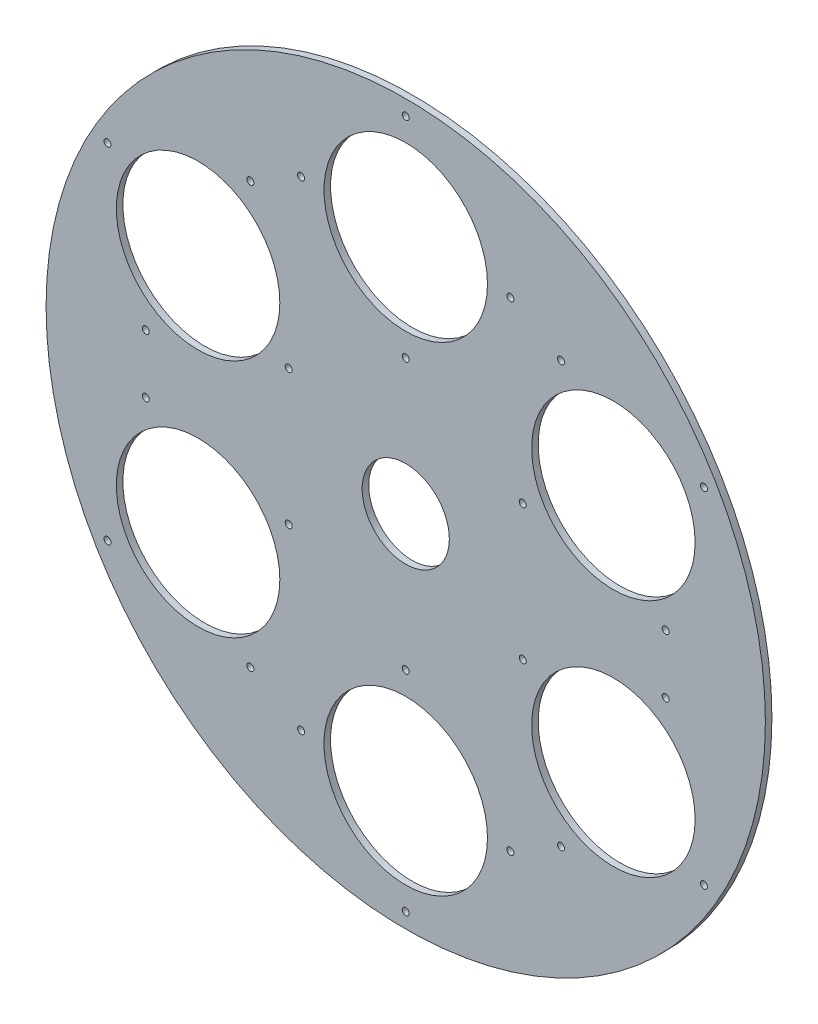
ISO-10303-21;
HEADER;
FILE_DESCRIPTION(('STEP AP214'),'2;1');
FILE_NAME('part.step','',(''),(''),'','','');
FILE_SCHEMA(('AUTOMOTIVE_DESIGN { 1 0 10303 214 1 1 1 1 }'));
ENDSEC;
DATA;
#1=APPLICATION_CONTEXT('core data for automotive mechanical design processes');
#2=APPLICATION_PROTOCOL_DEFINITION('international standard','automotive_design',2000,#1);
#3=PRODUCT_CONTEXT('',#1,'mechanical');
#4=PRODUCT('Part','Part','',(#3));
#5=PRODUCT_RELATED_PRODUCT_CATEGORY('part','',(#4));
#6=PRODUCT_DEFINITION_FORMATION('','',#4);
#7=PRODUCT_DEFINITION_CONTEXT('part definition',#1,'design');
#8=PRODUCT_DEFINITION('design','',#6,#7);
#9=PRODUCT_DEFINITION_SHAPE('','',#8);
#10=(LENGTH_UNIT() NAMED_UNIT(*) SI_UNIT(.MILLI.,.METRE.));
#11=(NAMED_UNIT(*) PLANE_ANGLE_UNIT() SI_UNIT($,.RADIAN.));
#12=(NAMED_UNIT(*) SI_UNIT($,.STERADIAN.) SOLID_ANGLE_UNIT());
#13=UNCERTAINTY_MEASURE_WITH_UNIT(LENGTH_MEASURE(1.E-05),#10,'distance_accuracy_value','');
#14=(GEOMETRIC_REPRESENTATION_CONTEXT(3) GLOBAL_UNCERTAINTY_ASSIGNED_CONTEXT((#13)) GLOBAL_UNIT_ASSIGNED_CONTEXT((#10,
#11,#12)) REPRESENTATION_CONTEXT('',''));
#15=CARTESIAN_POINT('',(0.,0.,0.));
#16=DIRECTION('',(0.,0.,1.));
#17=DIRECTION('',(1.,0.,0.));
#18=AXIS2_PLACEMENT_3D('',#15,#16,#17);
#19=CARTESIAN_POINT('',(0.,0.,3.));
#20=DIRECTION('',(0.,0.,1.));
#21=DIRECTION('',(1.,0.,0.));
#22=AXIS2_PLACEMENT_3D('',#19,#20,#21);
#23=PLANE('',#22);
#24=CARTESIAN_POINT('',(-95.2627944162812,-55.0000000000041,3.));
#25=DIRECTION('',(0.,0.,1.));
#26=DIRECTION('',(1.,0.,0.));
#27=AXIS2_PLACEMENT_3D('',#24,#25,#26);
#28=CIRCLE('',#27,37.5);
#29=CARTESIAN_POINT('',(-57.7627944162812,-55.0000000000041,3.));
#30=VERTEX_POINT('',#29);
#31=EDGE_CURVE('E284',#30,#30,#28,.T.);
#32=ORIENTED_EDGE('',*,*,#31,.F.);
#33=EDGE_LOOP('',(#32));
#34=FACE_BOUND('',#33,.T.);
#35=CARTESIAN_POINT('',(95.2627944162953,-54.9999999999959,3.));
#36=DIRECTION('',(0.,0.,1.));
#37=DIRECTION('',(1.,0.,0.));
#38=AXIS2_PLACEMENT_3D('',#35,#36,#37);
#39=CIRCLE('',#38,37.5);
#40=CARTESIAN_POINT('',(132.762794416295,-54.9999999999959,3.));
#41=VERTEX_POINT('',#40);
#42=EDGE_CURVE('E268',#41,#41,#39,.T.);
#43=ORIENTED_EDGE('',*,*,#42,.F.);
#44=EDGE_LOOP('',(#43));
#45=FACE_BOUND('',#44,.T.);
#46=CARTESIAN_POINT('',(0.,0.,3.));
#47=DIRECTION('',(0.,0.,1.));
#48=DIRECTION('',(1.,0.,0.));
#49=AXIS2_PLACEMENT_3D('',#46,#47,#48);
#50=CIRCLE('',#49,20.);
#51=CARTESIAN_POINT('',(20.,0.,3.));
#52=VERTEX_POINT('',#51);
#53=EDGE_CURVE('E252',#52,#52,#50,.T.);
#54=ORIENTED_EDGE('',*,*,#53,.F.);
#55=EDGE_LOOP('',(#54));
#56=FACE_BOUND('',#55,.T.);
#57=CARTESIAN_POINT('',(-71.2627944162868,96.5692193816537,3.));
#58=DIRECTION('',(0.,0.,1.));
#59=DIRECTION('',(1.,0.,0.));
#60=AXIS2_PLACEMENT_3D('',#57,#58,#59);
#61=CIRCLE('',#60,1.60000000000001);
#62=CARTESIAN_POINT('',(-69.6627944162868,96.5692193816537,3.));
#63=VERTEX_POINT('',#62);
#64=EDGE_CURVE('E236',#63,#63,#61,.T.);
#65=ORIENTED_EDGE('',*,*,#64,.F.);
#66=EDGE_LOOP('',(#65));
#67=FACE_BOUND('',#66,.T.);
#68=CARTESIAN_POINT('',(-119.262794416287,13.4307806183446,3.));
#69=DIRECTION('',(0.,0.,1.));
#70=DIRECTION('',(1.,0.,0.));
#71=AXIS2_PLACEMENT_3D('',#68,#69,#70);
#72=CIRCLE('',#71,1.6);
#73=CARTESIAN_POINT('',(-117.662794416287,13.4307806183446,3.));
#74=VERTEX_POINT('',#73);
#75=EDGE_CURVE('E220',#74,#74,#72,.T.);
#76=ORIENTED_EDGE('',*,*,#75,.F.);
#77=EDGE_LOOP('',(#76));
#78=FACE_BOUND('',#77,.T.);
#79=CARTESIAN_POINT('',(-119.262794416284,-13.4307806183493,3.));
#80=DIRECTION('',(0.,0.,1.));
#81=DIRECTION('',(1.,0.,0.));
#82=AXIS2_PLACEMENT_3D('',#79,#80,#81);
#83=CIRCLE('',#82,1.6);
#84=CARTESIAN_POINT('',(-117.662794416284,-13.4307806183493,3.));
#85=VERTEX_POINT('',#84);
#86=EDGE_CURVE('E204',#85,#85,#83,.T.);
#87=ORIENTED_EDGE('',*,*,#86,.F.);
#88=EDGE_LOOP('',(#87));
#89=FACE_BOUND('',#88,.T.);
#90=CARTESIAN_POINT('',(-71.2627944162843,-96.5692193816554,3.));
#91=DIRECTION('',(0.,0.,1.));
#92=DIRECTION('',(1.,0.,0.));
#93=AXIS2_PLACEMENT_3D('',#90,#91,#92);
#94=CIRCLE('',#93,1.60000000000001);
#95=CARTESIAN_POINT('',(-69.6627944162843,-96.5692193816554,3.));
#96=VERTEX_POINT('',#95);
#97=EDGE_CURVE('E188',#96,#96,#94,.T.);
#98=ORIENTED_EDGE('',*,*,#97,.F.);
#99=EDGE_LOOP('',(#98));
#100=FACE_BOUND('',#99,.T.);
#101=CARTESIAN_POINT('',(-47.9999999999947,-110.,3.));
#102=DIRECTION('',(0.,0.,1.));
#103=DIRECTION('',(1.,0.,0.));
#104=AXIS2_PLACEMENT_3D('',#101,#102,#103);
#105=CIRCLE('',#104,1.6);
#106=CARTESIAN_POINT('',(-46.3999999999947,-110.,3.));
#107=VERTEX_POINT('',#106);
#108=EDGE_CURVE('E172',#107,#107,#105,.T.);
#109=ORIENTED_EDGE('',*,*,#108,.F.);
#110=EDGE_LOOP('',(#109));
#111=FACE_BOUND('',#110,.T.);
#112=CARTESIAN_POINT('',(48.0000000000053,-110.,3.));
#113=DIRECTION('',(0.,0.,1.));
#114=DIRECTION('',(1.,0.,0.));
#115=AXIS2_PLACEMENT_3D('',#112,#113,#114);
#116=CIRCLE('',#115,1.6);
#117=CARTESIAN_POINT('',(49.6000000000053,-110.,3.));
#118=VERTEX_POINT('',#117);
#119=EDGE_CURVE('E156',#118,#118,#116,.T.);
#120=ORIENTED_EDGE('',*,*,#119,.F.);
#121=EDGE_LOOP('',(#120));
#122=FACE_BOUND('',#121,.T.);
#123=CARTESIAN_POINT('',(71.2627944162922,-96.5692193816508,3.));
#124=DIRECTION('',(0.,0.,1.));
#125=DIRECTION('',(1.,0.,0.));
#126=AXIS2_PLACEMENT_3D('',#123,#124,#125);
#127=CIRCLE('',#126,1.60000000000001);
#128=CARTESIAN_POINT('',(72.8627944162922,-96.5692193816508,3.));
#129=VERTEX_POINT('',#128);
#130=EDGE_CURVE('E140',#129,#129,#127,.T.);
#131=ORIENTED_EDGE('',*,*,#130,.F.);
#132=EDGE_LOOP('',(#131));
#133=FACE_BOUND('',#132,.T.);
#134=CARTESIAN_POINT('',(48.,110.,3.));
#135=DIRECTION('',(0.,0.,1.));
#136=DIRECTION('',(1.,0.,0.));
#137=AXIS2_PLACEMENT_3D('',#134,#135,#136);
#138=CIRCLE('',#137,1.6);
#139=CARTESIAN_POINT('',(49.6,110.,3.));
#140=VERTEX_POINT('',#139);
#141=EDGE_CURVE('E124',#140,#140,#138,.T.);
#142=ORIENTED_EDGE('',*,*,#141,.F.);
#143=EDGE_LOOP('',(#142));
#144=FACE_BOUND('',#143,.T.);
#145=CARTESIAN_POINT('',(136.832013797945,-78.9999999999977,3.));
#146=DIRECTION('',(0.,0.,1.));
#147=DIRECTION('',(1.,0.,0.));
#148=AXIS2_PLACEMENT_3D('',#145,#146,#147);
#149=CIRCLE('',#148,1.59999999999999);
#150=CARTESIAN_POINT('',(138.432013797945,-78.9999999999977,3.));
#151=VERTEX_POINT('',#150);
#152=EDGE_CURVE('E108',#151,#151,#149,.T.);
#153=ORIENTED_EDGE('',*,*,#152,.F.);
#154=EDGE_LOOP('',(#153));
#155=FACE_BOUND('',#154,.T.);
#156=CARTESIAN_POINT('',(53.693575034635,31.0000000000003,3.));
#157=DIRECTION('',(0.,0.,1.));
#158=DIRECTION('',(1.,0.,0.));
#159=AXIS2_PLACEMENT_3D('',#156,#157,#158);
#160=CIRCLE('',#159,1.6);
#161=CARTESIAN_POINT('',(55.293575034635,31.0000000000003,3.));
#162=VERTEX_POINT('',#161);
#163=EDGE_CURVE('E92',#162,#162,#160,.T.);
#164=ORIENTED_EDGE('',*,*,#163,.F.);
#165=EDGE_LOOP('',(#164));
#166=FACE_BOUND('',#165,.T.);
#167=CARTESIAN_POINT('',(136.832013797942,78.9999999999995,3.));
#168=DIRECTION('',(0.,0.,1.));
#169=DIRECTION('',(1.,0.,0.));
#170=AXIS2_PLACEMENT_3D('',#167,#168,#169);
#171=CIRCLE('',#170,1.59999999999999);
#172=CARTESIAN_POINT('',(138.432013797942,78.9999999999995,3.));
#173=VERTEX_POINT('',#172);
#174=EDGE_CURVE('E76',#173,#173,#171,.T.);
#175=ORIENTED_EDGE('',*,*,#174,.F.);
#176=EDGE_LOOP('',(#175));
#177=FACE_BOUND('',#176,.T.);
#178=CARTESIAN_POINT('',(71.2627944162885,96.5692193816529,3.));
#179=DIRECTION('',(0.,0.,1.));
#180=DIRECTION('',(1.,0.,0.));
#181=AXIS2_PLACEMENT_3D('',#178,#179,#180);
#182=CIRCLE('',#181,1.60000000000001);
#183=CARTESIAN_POINT('',(72.8627944162885,96.5692193816529,3.));
#184=VERTEX_POINT('',#183);
#185=EDGE_CURVE('E60',#184,#184,#182,.T.);
#186=ORIENTED_EDGE('',*,*,#185,.F.);
#187=EDGE_LOOP('',(#186));
#188=FACE_BOUND('',#187,.T.);
#189=CARTESIAN_POINT('',(0.,0.,3.));
#190=DIRECTION('',(0.,0.,1.));
#191=DIRECTION('',(1.,0.,0.));
#192=AXIS2_PLACEMENT_3D('',#189,#190,#191);
#193=CIRCLE('',#192,165.000000000005);
#194=CARTESIAN_POINT('',(165.000000000005,0.,3.));
#195=VERTEX_POINT('',#194);
#196=EDGE_CURVE('E10',#195,#195,#193,.T.);
#197=ORIENTED_EDGE('',*,*,#196,.T.);
#198=EDGE_LOOP('',(#197));
#199=FACE_BOUND('',#198,.T.);
#200=CARTESIAN_POINT('',(0.,110.,3.));
#201=DIRECTION('',(0.,0.,1.));
#202=DIRECTION('',(1.,0.,0.));
#203=AXIS2_PLACEMENT_3D('',#200,#201,#202);
#204=CIRCLE('',#203,37.5);
#205=CARTESIAN_POINT('',(37.5,110.,3.));
#206=VERTEX_POINT('',#205);
#207=EDGE_CURVE('E54',#206,#206,#204,.T.);
#208=ORIENTED_EDGE('',*,*,#207,.F.);
#209=EDGE_LOOP('',(#208));
#210=FACE_BOUND('',#209,.T.);
#211=CARTESIAN_POINT('',(-48.,110.,3.));
#212=DIRECTION('',(0.,0.,1.));
#213=DIRECTION('',(1.,0.,0.));
#214=AXIS2_PLACEMENT_3D('',#211,#212,#213);
#215=CIRCLE('',#214,1.6);
#216=CARTESIAN_POINT('',(-46.4,110.,3.));
#217=VERTEX_POINT('',#216);
#218=EDGE_CURVE('E68',#217,#217,#215,.T.);
#219=ORIENTED_EDGE('',*,*,#218,.F.);
#220=EDGE_LOOP('',(#219));
#221=FACE_BOUND('',#220,.T.);
#222=CARTESIAN_POINT('',(119.262794416288,13.4307806183465,3.));
#223=DIRECTION('',(0.,0.,1.));
#224=DIRECTION('',(1.,0.,0.));
#225=AXIS2_PLACEMENT_3D('',#222,#223,#224);
#226=CIRCLE('',#225,1.6);
#227=CARTESIAN_POINT('',(120.862794416288,13.4307806183465,3.));
#228=VERTEX_POINT('',#227);
#229=EDGE_CURVE('E84',#228,#228,#226,.T.);
#230=ORIENTED_EDGE('',*,*,#229,.F.);
#231=EDGE_LOOP('',(#230));
#232=FACE_BOUND('',#231,.T.);
#233=CARTESIAN_POINT('',(119.262794416292,-13.4307806183446,3.));
#234=DIRECTION('',(0.,0.,1.));
#235=DIRECTION('',(1.,0.,0.));
#236=AXIS2_PLACEMENT_3D('',#233,#234,#235);
#237=CIRCLE('',#236,1.6);
#238=CARTESIAN_POINT('',(120.862794416292,-13.4307806183446,3.));
#239=VERTEX_POINT('',#238);
#240=EDGE_CURVE('E100',#239,#239,#237,.T.);
#241=ORIENTED_EDGE('',*,*,#240,.F.);
#242=EDGE_LOOP('',(#241));
#243=FACE_BOUND('',#242,.T.);
#244=CARTESIAN_POINT('',(1.66533453693773E-13,158.,3.));
#245=DIRECTION('',(0.,0.,1.));
#246=DIRECTION('',(1.,0.,0.));
#247=AXIS2_PLACEMENT_3D('',#244,#245,#246);
#248=CIRCLE('',#247,1.6);
#249=CARTESIAN_POINT('',(1.60000000000016,158.,3.));
#250=VERTEX_POINT('',#249);
#251=EDGE_CURVE('E116',#250,#250,#248,.T.);
#252=ORIENTED_EDGE('',*,*,#251,.F.);
#253=EDGE_LOOP('',(#252));
#254=FACE_BOUND('',#253,.T.);
#255=CARTESIAN_POINT('',(-4.9960036108132E-13,62.,3.));
#256=DIRECTION('',(0.,0.,1.));
#257=DIRECTION('',(1.,0.,0.));
#258=AXIS2_PLACEMENT_3D('',#255,#256,#257);
#259=CIRCLE('',#258,1.6);
#260=CARTESIAN_POINT('',(1.5999999999995,62.,3.));
#261=VERTEX_POINT('',#260);
#262=EDGE_CURVE('E132',#261,#261,#259,.T.);
#263=ORIENTED_EDGE('',*,*,#262,.F.);
#264=EDGE_LOOP('',(#263));
#265=FACE_BOUND('',#264,.T.);
#266=CARTESIAN_POINT('',(53.6935750346391,-30.9999999999977,3.));
#267=DIRECTION('',(0.,0.,1.));
#268=DIRECTION('',(1.,0.,0.));
#269=AXIS2_PLACEMENT_3D('',#266,#267,#268);
#270=CIRCLE('',#269,1.6);
#271=CARTESIAN_POINT('',(55.2935750346391,-30.9999999999977,3.));
#272=VERTEX_POINT('',#271);
#273=EDGE_CURVE('E148',#272,#272,#270,.T.);
#274=ORIENTED_EDGE('',*,*,#273,.F.);
#275=EDGE_LOOP('',(#274));
#276=FACE_BOUND('',#275,.T.);
#277=CARTESIAN_POINT('',(5.27542201025743E-12,-158.,3.));
#278=DIRECTION('',(0.,0.,1.));
#279=DIRECTION('',(1.,0.,0.));
#280=AXIS2_PLACEMENT_3D('',#277,#278,#279);
#281=CIRCLE('',#280,1.6);
#282=CARTESIAN_POINT('',(1.60000000000527,-158.,3.));
#283=VERTEX_POINT('',#282);
#284=EDGE_CURVE('E164',#283,#283,#281,.T.);
#285=ORIENTED_EDGE('',*,*,#284,.F.);
#286=EDGE_LOOP('',(#285));
#287=FACE_BOUND('',#286,.T.);
#288=CARTESIAN_POINT('',(5.24178813000589E-12,-62.,3.));
#289=DIRECTION('',(0.,0.,1.));
#290=DIRECTION('',(1.,0.,0.));
#291=AXIS2_PLACEMENT_3D('',#288,#289,#290);
#292=CIRCLE('',#291,1.6);
#293=CARTESIAN_POINT('',(1.60000000000524,-62.,3.));
#294=VERTEX_POINT('',#293);
#295=EDGE_CURVE('E180',#294,#294,#292,.T.);
#296=ORIENTED_EDGE('',*,*,#295,.F.);
#297=EDGE_LOOP('',(#296));
#298=FACE_BOUND('',#297,.T.);
#299=CARTESIAN_POINT('',(-136.832013797937,-79.0000000000024,3.));
#300=DIRECTION('',(0.,0.,1.));
#301=DIRECTION('',(1.,0.,0.));
#302=AXIS2_PLACEMENT_3D('',#299,#300,#301);
#303=CIRCLE('',#302,1.59999999999999);
#304=CARTESIAN_POINT('',(-135.232013797937,-79.0000000000024,3.));
#305=VERTEX_POINT('',#304);
#306=EDGE_CURVE('E196',#305,#305,#303,.T.);
#307=ORIENTED_EDGE('',*,*,#306,.F.);
#308=EDGE_LOOP('',(#307));
#309=FACE_BOUND('',#308,.T.);
#310=CARTESIAN_POINT('',(-53.6935750346313,-31.0000000000023,3.));
#311=DIRECTION('',(0.,0.,1.));
#312=DIRECTION('',(1.,0.,0.));
#313=AXIS2_PLACEMENT_3D('',#310,#311,#312);
#314=CIRCLE('',#313,1.6);
#315=CARTESIAN_POINT('',(-52.0935750346313,-31.0000000000023,3.));
#316=VERTEX_POINT('',#315);
#317=EDGE_CURVE('E212',#316,#316,#314,.T.);
#318=ORIENTED_EDGE('',*,*,#317,.F.);
#319=EDGE_LOOP('',(#318));
#320=FACE_BOUND('',#319,.T.);
#321=CARTESIAN_POINT('',(-136.83201379794,78.9999999999976,3.));
#322=DIRECTION('',(0.,0.,1.));
#323=DIRECTION('',(1.,0.,0.));
#324=AXIS2_PLACEMENT_3D('',#321,#322,#323);
#325=CIRCLE('',#324,1.59999999999999);
#326=CARTESIAN_POINT('',(-135.23201379794,78.9999999999976,3.));
#327=VERTEX_POINT('',#326);
#328=EDGE_CURVE('E228',#327,#327,#325,.T.);
#329=ORIENTED_EDGE('',*,*,#328,.F.);
#330=EDGE_LOOP('',(#329));
#331=FACE_BOUND('',#330,.T.);
#332=CARTESIAN_POINT('',(-53.6935750346351,31.0000000000002,3.));
#333=DIRECTION('',(0.,0.,1.));
#334=DIRECTION('',(1.,0.,0.));
#335=AXIS2_PLACEMENT_3D('',#332,#333,#334);
#336=CIRCLE('',#335,1.6);
#337=CARTESIAN_POINT('',(-52.0935750346351,31.0000000000002,3.));
#338=VERTEX_POINT('',#337);
#339=EDGE_CURVE('E244',#338,#338,#336,.T.);
#340=ORIENTED_EDGE('',*,*,#339,.F.);
#341=EDGE_LOOP('',(#340));
#342=FACE_BOUND('',#341,.T.);
#343=CARTESIAN_POINT('',(95.2627944162906,55.0000000000041,3.));
#344=DIRECTION('',(0.,0.,1.));
#345=DIRECTION('',(1.,0.,0.));
#346=AXIS2_PLACEMENT_3D('',#343,#344,#345);
#347=CIRCLE('',#346,37.5);
#348=CARTESIAN_POINT('',(132.762794416291,55.0000000000041,3.));
#349=VERTEX_POINT('',#348);
#350=EDGE_CURVE('E260',#349,#349,#347,.T.);
#351=ORIENTED_EDGE('',*,*,#350,.F.);
#352=EDGE_LOOP('',(#351));
#353=FACE_BOUND('',#352,.T.);
#354=CARTESIAN_POINT('',(9.33875076766146E-12,-110.,3.));
#355=DIRECTION('',(0.,0.,1.));
#356=DIRECTION('',(1.,0.,0.));
#357=AXIS2_PLACEMENT_3D('',#354,#355,#356);
#358=CIRCLE('',#357,37.5);
#359=CARTESIAN_POINT('',(37.5000000000093,-110.,3.));
#360=VERTEX_POINT('',#359);
#361=EDGE_CURVE('E276',#360,#360,#358,.T.);
#362=ORIENTED_EDGE('',*,*,#361,.F.);
#363=EDGE_LOOP('',(#362));
#364=FACE_BOUND('',#363,.T.);
#365=CARTESIAN_POINT('',(-95.262794416286,54.9999999999959,3.));
#366=DIRECTION('',(0.,0.,1.));
#367=DIRECTION('',(1.,0.,0.));
#368=AXIS2_PLACEMENT_3D('',#365,#366,#367);
#369=CIRCLE('',#368,37.5);
#370=CARTESIAN_POINT('',(-57.762794416286,54.9999999999959,3.));
#371=VERTEX_POINT('',#370);
#372=EDGE_CURVE('E292',#371,#371,#369,.T.);
#373=ORIENTED_EDGE('',*,*,#372,.F.);
#374=EDGE_LOOP('',(#373));
#375=FACE_BOUND('',#374,.T.);
#376=ADVANCED_FACE('F41',(#34,#45,#56,#67,#78,#89,#100,#111,#122,#133,#144,#155,#166,#177,#188,
#199,#210,#221,#232,#243,#254,#265,#276,#287,#298,#309,#320,#331,#342,#353,#364,#375),#23,.T.);
#377=CARTESIAN_POINT('',(0.,0.,0.));
#378=DIRECTION('',(0.,0.,1.));
#379=DIRECTION('',(1.,0.,0.));
#380=AXIS2_PLACEMENT_3D('',#377,#378,#379);
#381=PLANE('',#380);
#382=CARTESIAN_POINT('',(0.,0.,0.));
#383=DIRECTION('',(0.,0.,1.));
#384=DIRECTION('',(1.,0.,0.));
#385=AXIS2_PLACEMENT_3D('',#382,#383,#384);
#386=CIRCLE('',#385,165.000000000005);
#387=CARTESIAN_POINT('',(165.000000000005,0.,0.));
#388=VERTEX_POINT('',#387);
#389=EDGE_CURVE('E45',#388,#388,#386,.T.);
#390=ORIENTED_EDGE('',*,*,#389,.F.);
#391=EDGE_LOOP('',(#390));
#392=FACE_BOUND('',#391,.T.);
#393=CARTESIAN_POINT('',(0.,110.,0.));
#394=DIRECTION('',(0.,0.,1.));
#395=DIRECTION('',(1.,0.,0.));
#396=AXIS2_PLACEMENT_3D('',#393,#394,#395);
#397=CIRCLE('',#396,37.5);
#398=CARTESIAN_POINT('',(37.5,110.,0.));
#399=VERTEX_POINT('',#398);
#400=EDGE_CURVE('E56',#399,#399,#397,.T.);
#401=ORIENTED_EDGE('',*,*,#400,.T.);
#402=EDGE_LOOP('',(#401));
#403=FACE_BOUND('',#402,.T.);
#404=CARTESIAN_POINT('',(71.2627944162885,96.5692193816529,0.));
#405=DIRECTION('',(0.,0.,1.));
#406=DIRECTION('',(1.,0.,0.));
#407=AXIS2_PLACEMENT_3D('',#404,#405,#406);
#408=CIRCLE('',#407,1.60000000000001);
#409=CARTESIAN_POINT('',(72.8627944162885,96.5692193816529,0.));
#410=VERTEX_POINT('',#409);
#411=EDGE_CURVE('E64',#410,#410,#408,.T.);
#412=ORIENTED_EDGE('',*,*,#411,.T.);
#413=EDGE_LOOP('',(#412));
#414=FACE_BOUND('',#413,.T.);
#415=CARTESIAN_POINT('',(-48.,110.,0.));
#416=DIRECTION('',(0.,0.,1.));
#417=DIRECTION('',(1.,0.,0.));
#418=AXIS2_PLACEMENT_3D('',#415,#416,#417);
#419=CIRCLE('',#418,1.6);
#420=CARTESIAN_POINT('',(-46.4,110.,0.));
#421=VERTEX_POINT('',#420);
#422=EDGE_CURVE('E72',#421,#421,#419,.T.);
#423=ORIENTED_EDGE('',*,*,#422,.T.);
#424=EDGE_LOOP('',(#423));
#425=FACE_BOUND('',#424,.T.);
#426=CARTESIAN_POINT('',(136.832013797942,78.9999999999995,0.));
#427=DIRECTION('',(0.,0.,1.));
#428=DIRECTION('',(1.,0.,0.));
#429=AXIS2_PLACEMENT_3D('',#426,#427,#428);
#430=CIRCLE('',#429,1.59999999999999);
#431=CARTESIAN_POINT('',(138.432013797942,78.9999999999995,0.));
#432=VERTEX_POINT('',#431);
#433=EDGE_CURVE('E80',#432,#432,#430,.T.);
#434=ORIENTED_EDGE('',*,*,#433,.T.);
#435=EDGE_LOOP('',(#434));
#436=FACE_BOUND('',#435,.T.);
#437=CARTESIAN_POINT('',(119.262794416288,13.4307806183465,0.));
#438=DIRECTION('',(0.,0.,1.));
#439=DIRECTION('',(1.,0.,0.));
#440=AXIS2_PLACEMENT_3D('',#437,#438,#439);
#441=CIRCLE('',#440,1.6);
#442=CARTESIAN_POINT('',(120.862794416288,13.4307806183465,0.));
#443=VERTEX_POINT('',#442);
#444=EDGE_CURVE('E88',#443,#443,#441,.T.);
#445=ORIENTED_EDGE('',*,*,#444,.T.);
#446=EDGE_LOOP('',(#445));
#447=FACE_BOUND('',#446,.T.);
#448=CARTESIAN_POINT('',(53.693575034635,31.0000000000003,0.));
#449=DIRECTION('',(0.,0.,1.));
#450=DIRECTION('',(1.,0.,0.));
#451=AXIS2_PLACEMENT_3D('',#448,#449,#450);
#452=CIRCLE('',#451,1.6);
#453=CARTESIAN_POINT('',(55.293575034635,31.0000000000003,0.));
#454=VERTEX_POINT('',#453);
#455=EDGE_CURVE('E96',#454,#454,#452,.T.);
#456=ORIENTED_EDGE('',*,*,#455,.T.);
#457=EDGE_LOOP('',(#456));
#458=FACE_BOUND('',#457,.T.);
#459=CARTESIAN_POINT('',(119.262794416292,-13.4307806183446,0.));
#460=DIRECTION('',(0.,0.,1.));
#461=DIRECTION('',(1.,0.,0.));
#462=AXIS2_PLACEMENT_3D('',#459,#460,#461);
#463=CIRCLE('',#462,1.6);
#464=CARTESIAN_POINT('',(120.862794416292,-13.4307806183446,0.));
#465=VERTEX_POINT('',#464);
#466=EDGE_CURVE('E104',#465,#465,#463,.T.);
#467=ORIENTED_EDGE('',*,*,#466,.T.);
#468=EDGE_LOOP('',(#467));
#469=FACE_BOUND('',#468,.T.);
#470=CARTESIAN_POINT('',(136.832013797945,-78.9999999999977,0.));
#471=DIRECTION('',(0.,0.,1.));
#472=DIRECTION('',(1.,0.,0.));
#473=AXIS2_PLACEMENT_3D('',#470,#471,#472);
#474=CIRCLE('',#473,1.59999999999999);
#475=CARTESIAN_POINT('',(138.432013797945,-78.9999999999977,0.));
#476=VERTEX_POINT('',#475);
#477=EDGE_CURVE('E112',#476,#476,#474,.T.);
#478=ORIENTED_EDGE('',*,*,#477,.T.);
#479=EDGE_LOOP('',(#478));
#480=FACE_BOUND('',#479,.T.);
#481=CARTESIAN_POINT('',(1.66533453693773E-13,158.,0.));
#482=DIRECTION('',(0.,0.,1.));
#483=DIRECTION('',(1.,0.,0.));
#484=AXIS2_PLACEMENT_3D('',#481,#482,#483);
#485=CIRCLE('',#484,1.6);
#486=CARTESIAN_POINT('',(1.60000000000016,158.,0.));
#487=VERTEX_POINT('',#486);
#488=EDGE_CURVE('E120',#487,#487,#485,.T.);
#489=ORIENTED_EDGE('',*,*,#488,.T.);
#490=EDGE_LOOP('',(#489));
#491=FACE_BOUND('',#490,.T.);
#492=CARTESIAN_POINT('',(48.,110.,0.));
#493=DIRECTION('',(0.,0.,1.));
#494=DIRECTION('',(1.,0.,0.));
#495=AXIS2_PLACEMENT_3D('',#492,#493,#494);
#496=CIRCLE('',#495,1.6);
#497=CARTESIAN_POINT('',(49.6,110.,0.));
#498=VERTEX_POINT('',#497);
#499=EDGE_CURVE('E128',#498,#498,#496,.T.);
#500=ORIENTED_EDGE('',*,*,#499,.T.);
#501=EDGE_LOOP('',(#500));
#502=FACE_BOUND('',#501,.T.);
#503=CARTESIAN_POINT('',(-4.9960036108132E-13,62.,0.));
#504=DIRECTION('',(0.,0.,1.));
#505=DIRECTION('',(1.,0.,0.));
#506=AXIS2_PLACEMENT_3D('',#503,#504,#505);
#507=CIRCLE('',#506,1.6);
#508=CARTESIAN_POINT('',(1.5999999999995,62.,0.));
#509=VERTEX_POINT('',#508);
#510=EDGE_CURVE('E136',#509,#509,#507,.T.);
#511=ORIENTED_EDGE('',*,*,#510,.T.);
#512=EDGE_LOOP('',(#511));
#513=FACE_BOUND('',#512,.T.);
#514=CARTESIAN_POINT('',(71.2627944162922,-96.5692193816508,0.));
#515=DIRECTION('',(0.,0.,1.));
#516=DIRECTION('',(1.,0.,0.));
#517=AXIS2_PLACEMENT_3D('',#514,#515,#516);
#518=CIRCLE('',#517,1.60000000000001);
#519=CARTESIAN_POINT('',(72.8627944162922,-96.5692193816508,0.));
#520=VERTEX_POINT('',#519);
#521=EDGE_CURVE('E144',#520,#520,#518,.T.);
#522=ORIENTED_EDGE('',*,*,#521,.T.);
#523=EDGE_LOOP('',(#522));
#524=FACE_BOUND('',#523,.T.);
#525=CARTESIAN_POINT('',(53.6935750346391,-30.9999999999977,0.));
#526=DIRECTION('',(0.,0.,1.));
#527=DIRECTION('',(1.,0.,0.));
#528=AXIS2_PLACEMENT_3D('',#525,#526,#527);
#529=CIRCLE('',#528,1.6);
#530=CARTESIAN_POINT('',(55.2935750346391,-30.9999999999977,0.));
#531=VERTEX_POINT('',#530);
#532=EDGE_CURVE('E152',#531,#531,#529,.T.);
#533=ORIENTED_EDGE('',*,*,#532,.T.);
#534=EDGE_LOOP('',(#533));
#535=FACE_BOUND('',#534,.T.);
#536=CARTESIAN_POINT('',(48.0000000000053,-110.,0.));
#537=DIRECTION('',(0.,0.,1.));
#538=DIRECTION('',(1.,0.,0.));
#539=AXIS2_PLACEMENT_3D('',#536,#537,#538);
#540=CIRCLE('',#539,1.6);
#541=CARTESIAN_POINT('',(49.6000000000053,-110.,0.));
#542=VERTEX_POINT('',#541);
#543=EDGE_CURVE('E160',#542,#542,#540,.T.);
#544=ORIENTED_EDGE('',*,*,#543,.T.);
#545=EDGE_LOOP('',(#544));
#546=FACE_BOUND('',#545,.T.);
#547=CARTESIAN_POINT('',(5.27542201025743E-12,-158.,0.));
#548=DIRECTION('',(0.,0.,1.));
#549=DIRECTION('',(1.,0.,0.));
#550=AXIS2_PLACEMENT_3D('',#547,#548,#549);
#551=CIRCLE('',#550,1.6);
#552=CARTESIAN_POINT('',(1.60000000000527,-158.,0.));
#553=VERTEX_POINT('',#552);
#554=EDGE_CURVE('E168',#553,#553,#551,.T.);
#555=ORIENTED_EDGE('',*,*,#554,.T.);
#556=EDGE_LOOP('',(#555));
#557=FACE_BOUND('',#556,.T.);
#558=CARTESIAN_POINT('',(-47.9999999999947,-110.,0.));
#559=DIRECTION('',(0.,0.,1.));
#560=DIRECTION('',(1.,0.,0.));
#561=AXIS2_PLACEMENT_3D('',#558,#559,#560);
#562=CIRCLE('',#561,1.6);
#563=CARTESIAN_POINT('',(-46.3999999999947,-110.,0.));
#564=VERTEX_POINT('',#563);
#565=EDGE_CURVE('E176',#564,#564,#562,.T.);
#566=ORIENTED_EDGE('',*,*,#565,.T.);
#567=EDGE_LOOP('',(#566));
#568=FACE_BOUND('',#567,.T.);
#569=CARTESIAN_POINT('',(5.24178813000589E-12,-62.,0.));
#570=DIRECTION('',(0.,0.,1.));
#571=DIRECTION('',(1.,0.,0.));
#572=AXIS2_PLACEMENT_3D('',#569,#570,#571);
#573=CIRCLE('',#572,1.6);
#574=CARTESIAN_POINT('',(1.60000000000524,-62.,0.));
#575=VERTEX_POINT('',#574);
#576=EDGE_CURVE('E184',#575,#575,#573,.T.);
#577=ORIENTED_EDGE('',*,*,#576,.T.);
#578=EDGE_LOOP('',(#577));
#579=FACE_BOUND('',#578,.T.);
#580=CARTESIAN_POINT('',(-71.2627944162843,-96.5692193816554,0.));
#581=DIRECTION('',(0.,0.,1.));
#582=DIRECTION('',(1.,0.,0.));
#583=AXIS2_PLACEMENT_3D('',#580,#581,#582);
#584=CIRCLE('',#583,1.60000000000001);
#585=CARTESIAN_POINT('',(-69.6627944162843,-96.5692193816554,0.));
#586=VERTEX_POINT('',#585);
#587=EDGE_CURVE('E192',#586,#586,#584,.T.);
#588=ORIENTED_EDGE('',*,*,#587,.T.);
#589=EDGE_LOOP('',(#588));
#590=FACE_BOUND('',#589,.T.);
#591=CARTESIAN_POINT('',(-136.832013797937,-79.0000000000024,0.));
#592=DIRECTION('',(0.,0.,1.));
#593=DIRECTION('',(1.,0.,0.));
#594=AXIS2_PLACEMENT_3D('',#591,#592,#593);
#595=CIRCLE('',#594,1.59999999999999);
#596=CARTESIAN_POINT('',(-135.232013797937,-79.0000000000024,0.));
#597=VERTEX_POINT('',#596);
#598=EDGE_CURVE('E200',#597,#597,#595,.T.);
#599=ORIENTED_EDGE('',*,*,#598,.T.);
#600=EDGE_LOOP('',(#599));
#601=FACE_BOUND('',#600,.T.);
#602=CARTESIAN_POINT('',(-119.262794416284,-13.4307806183493,0.));
#603=DIRECTION('',(0.,0.,1.));
#604=DIRECTION('',(1.,0.,0.));
#605=AXIS2_PLACEMENT_3D('',#602,#603,#604);
#606=CIRCLE('',#605,1.6);
#607=CARTESIAN_POINT('',(-117.662794416284,-13.4307806183493,0.));
#608=VERTEX_POINT('',#607);
#609=EDGE_CURVE('E208',#608,#608,#606,.T.);
#610=ORIENTED_EDGE('',*,*,#609,.T.);
#611=EDGE_LOOP('',(#610));
#612=FACE_BOUND('',#611,.T.);
#613=CARTESIAN_POINT('',(-53.6935750346313,-31.0000000000023,0.));
#614=DIRECTION('',(0.,0.,1.));
#615=DIRECTION('',(1.,0.,0.));
#616=AXIS2_PLACEMENT_3D('',#613,#614,#615);
#617=CIRCLE('',#616,1.6);
#618=CARTESIAN_POINT('',(-52.0935750346313,-31.0000000000023,0.));
#619=VERTEX_POINT('',#618);
#620=EDGE_CURVE('E216',#619,#619,#617,.T.);
#621=ORIENTED_EDGE('',*,*,#620,.T.);
#622=EDGE_LOOP('',(#621));
#623=FACE_BOUND('',#622,.T.);
#624=CARTESIAN_POINT('',(-119.262794416287,13.4307806183446,0.));
#625=DIRECTION('',(0.,0.,1.));
#626=DIRECTION('',(1.,0.,0.));
#627=AXIS2_PLACEMENT_3D('',#624,#625,#626);
#628=CIRCLE('',#627,1.6);
#629=CARTESIAN_POINT('',(-117.662794416287,13.4307806183446,0.));
#630=VERTEX_POINT('',#629);
#631=EDGE_CURVE('E224',#630,#630,#628,.T.);
#632=ORIENTED_EDGE('',*,*,#631,.T.);
#633=EDGE_LOOP('',(#632));
#634=FACE_BOUND('',#633,.T.);
#635=CARTESIAN_POINT('',(-136.83201379794,78.9999999999976,0.));
#636=DIRECTION('',(0.,0.,1.));
#637=DIRECTION('',(1.,0.,0.));
#638=AXIS2_PLACEMENT_3D('',#635,#636,#637);
#639=CIRCLE('',#638,1.59999999999999);
#640=CARTESIAN_POINT('',(-135.23201379794,78.9999999999976,0.));
#641=VERTEX_POINT('',#640);
#642=EDGE_CURVE('E232',#641,#641,#639,.T.);
#643=ORIENTED_EDGE('',*,*,#642,.T.);
#644=EDGE_LOOP('',(#643));
#645=FACE_BOUND('',#644,.T.);
#646=CARTESIAN_POINT('',(-71.2627944162868,96.5692193816537,0.));
#647=DIRECTION('',(0.,0.,1.));
#648=DIRECTION('',(1.,0.,0.));
#649=AXIS2_PLACEMENT_3D('',#646,#647,#648);
#650=CIRCLE('',#649,1.60000000000001);
#651=CARTESIAN_POINT('',(-69.6627944162868,96.5692193816537,0.));
#652=VERTEX_POINT('',#651);
#653=EDGE_CURVE('E240',#652,#652,#650,.T.);
#654=ORIENTED_EDGE('',*,*,#653,.T.);
#655=EDGE_LOOP('',(#654));
#656=FACE_BOUND('',#655,.T.);
#657=CARTESIAN_POINT('',(-53.6935750346351,31.0000000000002,0.));
#658=DIRECTION('',(0.,0.,1.));
#659=DIRECTION('',(1.,0.,0.));
#660=AXIS2_PLACEMENT_3D('',#657,#658,#659);
#661=CIRCLE('',#660,1.6);
#662=CARTESIAN_POINT('',(-52.0935750346351,31.0000000000002,0.));
#663=VERTEX_POINT('',#662);
#664=EDGE_CURVE('E248',#663,#663,#661,.T.);
#665=ORIENTED_EDGE('',*,*,#664,.T.);
#666=EDGE_LOOP('',(#665));
#667=FACE_BOUND('',#666,.T.);
#668=CARTESIAN_POINT('',(0.,0.,0.));
#669=DIRECTION('',(0.,0.,1.));
#670=DIRECTION('',(1.,0.,0.));
#671=AXIS2_PLACEMENT_3D('',#668,#669,#670);
#672=CIRCLE('',#671,20.);
#673=CARTESIAN_POINT('',(20.,0.,0.));
#674=VERTEX_POINT('',#673);
#675=EDGE_CURVE('E256',#674,#674,#672,.T.);
#676=ORIENTED_EDGE('',*,*,#675,.T.);
#677=EDGE_LOOP('',(#676));
#678=FACE_BOUND('',#677,.T.);
#679=CARTESIAN_POINT('',(95.2627944162906,55.0000000000041,0.));
#680=DIRECTION('',(0.,0.,1.));
#681=DIRECTION('',(1.,0.,0.));
#682=AXIS2_PLACEMENT_3D('',#679,#680,#681);
#683=CIRCLE('',#682,37.5);
#684=CARTESIAN_POINT('',(132.762794416291,55.0000000000041,0.));
#685=VERTEX_POINT('',#684);
#686=EDGE_CURVE('E264',#685,#685,#683,.T.);
#687=ORIENTED_EDGE('',*,*,#686,.T.);
#688=EDGE_LOOP('',(#687));
#689=FACE_BOUND('',#688,.T.);
#690=CARTESIAN_POINT('',(95.2627944162953,-54.9999999999959,0.));
#691=DIRECTION('',(0.,0.,1.));
#692=DIRECTION('',(1.,0.,0.));
#693=AXIS2_PLACEMENT_3D('',#690,#691,#692);
#694=CIRCLE('',#693,37.5);
#695=CARTESIAN_POINT('',(132.762794416295,-54.9999999999959,0.));
#696=VERTEX_POINT('',#695);
#697=EDGE_CURVE('E272',#696,#696,#694,.T.);
#698=ORIENTED_EDGE('',*,*,#697,.T.);
#699=EDGE_LOOP('',(#698));
#700=FACE_BOUND('',#699,.T.);
#701=CARTESIAN_POINT('',(9.33875076766146E-12,-110.,0.));
#702=DIRECTION('',(0.,0.,1.));
#703=DIRECTION('',(1.,0.,0.));
#704=AXIS2_PLACEMENT_3D('',#701,#702,#703);
#705=CIRCLE('',#704,37.5);
#706=CARTESIAN_POINT('',(37.5000000000093,-110.,0.));
#707=VERTEX_POINT('',#706);
#708=EDGE_CURVE('E280',#707,#707,#705,.T.);
#709=ORIENTED_EDGE('',*,*,#708,.T.);
#710=EDGE_LOOP('',(#709));
#711=FACE_BOUND('',#710,.T.);
#712=CARTESIAN_POINT('',(-95.2627944162812,-55.0000000000041,0.));
#713=DIRECTION('',(0.,0.,1.));
#714=DIRECTION('',(1.,0.,0.));
#715=AXIS2_PLACEMENT_3D('',#712,#713,#714);
#716=CIRCLE('',#715,37.5);
#717=CARTESIAN_POINT('',(-57.7627944162812,-55.0000000000041,0.));
#718=VERTEX_POINT('',#717);
#719=EDGE_CURVE('E288',#718,#718,#716,.T.);
#720=ORIENTED_EDGE('',*,*,#719,.T.);
#721=EDGE_LOOP('',(#720));
#722=FACE_BOUND('',#721,.T.);
#723=CARTESIAN_POINT('',(-95.262794416286,54.9999999999959,0.));
#724=DIRECTION('',(0.,0.,1.));
#725=DIRECTION('',(1.,0.,0.));
#726=AXIS2_PLACEMENT_3D('',#723,#724,#725);
#727=CIRCLE('',#726,37.5);
#728=CARTESIAN_POINT('',(-57.762794416286,54.9999999999959,0.));
#729=VERTEX_POINT('',#728);
#730=EDGE_CURVE('E296',#729,#729,#727,.T.);
#731=ORIENTED_EDGE('',*,*,#730,.T.);
#732=EDGE_LOOP('',(#731));
#733=FACE_BOUND('',#732,.T.);
#734=ADVANCED_FACE('F308',(#392,#403,#414,#425,#436,#447,#458,#469,#480,#491,#502,#513,#524,
#535,#546,#557,#568,#579,#590,#601,#612,#623,#634,#645,#656,#667,#678,#689,#700,#711,#722,#733),
#381,.F.);
#735=CARTESIAN_POINT('',(0.,0.,3.));
#736=DIRECTION('',(0.,0.,-1.));
#737=DIRECTION('',(-1.,0.,0.));
#738=AXIS2_PLACEMENT_3D('',#735,#736,#737);
#739=CYLINDRICAL_SURFACE('',#738,165.000000000005);
#740=ORIENTED_EDGE('',*,*,#196,.F.);
#741=EDGE_LOOP('',(#740));
#742=FACE_BOUND('',#741,.T.);
#743=ORIENTED_EDGE('',*,*,#389,.T.);
#744=EDGE_LOOP('',(#743));
#745=FACE_BOUND('',#744,.T.);
#746=ADVANCED_FACE('F43',(#742,#745),#739,.T.);
#747=CARTESIAN_POINT('',(0.,110.,3.));
#748=DIRECTION('',(0.,0.,-1.));
#749=DIRECTION('',(-1.,0.,0.));
#750=AXIS2_PLACEMENT_3D('',#747,#748,#749);
#751=CYLINDRICAL_SURFACE('',#750,37.5);
#752=ORIENTED_EDGE('',*,*,#207,.T.);
#753=EDGE_LOOP('',(#752));
#754=FACE_BOUND('',#753,.T.);
#755=ORIENTED_EDGE('',*,*,#400,.F.);
#756=EDGE_LOOP('',(#755));
#757=FACE_BOUND('',#756,.T.);
#758=ADVANCED_FACE('F318',(#754,#757),#751,.F.);
#759=CARTESIAN_POINT('',(71.2627944162885,96.5692193816529,3.));
#760=DIRECTION('',(0.,0.,-1.));
#761=DIRECTION('',(-1.,0.,0.));
#762=AXIS2_PLACEMENT_3D('',#759,#760,#761);
#763=CYLINDRICAL_SURFACE('',#762,1.60000000000001);
#764=ORIENTED_EDGE('',*,*,#185,.T.);
#765=EDGE_LOOP('',(#764));
#766=FACE_BOUND('',#765,.T.);
#767=ORIENTED_EDGE('',*,*,#411,.F.);
#768=EDGE_LOOP('',(#767));
#769=FACE_BOUND('',#768,.T.);
#770=ADVANCED_FACE('F321',(#766,#769),#763,.F.);
#771=CARTESIAN_POINT('',(-48.,110.,3.));
#772=DIRECTION('',(0.,0.,-1.));
#773=DIRECTION('',(-1.,0.,0.));
#774=AXIS2_PLACEMENT_3D('',#771,#772,#773);
#775=CYLINDRICAL_SURFACE('',#774,1.6);
#776=ORIENTED_EDGE('',*,*,#218,.T.);
#777=EDGE_LOOP('',(#776));
#778=FACE_BOUND('',#777,.T.);
#779=ORIENTED_EDGE('',*,*,#422,.F.);
#780=EDGE_LOOP('',(#779));
#781=FACE_BOUND('',#780,.T.);
#782=ADVANCED_FACE('F325',(#778,#781),#775,.F.);
#783=CARTESIAN_POINT('',(136.832013797942,78.9999999999995,3.));
#784=DIRECTION('',(0.,0.,-1.));
#785=DIRECTION('',(-1.,0.,0.));
#786=AXIS2_PLACEMENT_3D('',#783,#784,#785);
#787=CYLINDRICAL_SURFACE('',#786,1.59999999999999);
#788=ORIENTED_EDGE('',*,*,#174,.T.);
#789=EDGE_LOOP('',(#788));
#790=FACE_BOUND('',#789,.T.);
#791=ORIENTED_EDGE('',*,*,#433,.F.);
#792=EDGE_LOOP('',(#791));
#793=FACE_BOUND('',#792,.T.);
#794=ADVANCED_FACE('F329',(#790,#793),#787,.F.);
#795=CARTESIAN_POINT('',(119.262794416288,13.4307806183465,3.));
#796=DIRECTION('',(0.,0.,-1.));
#797=DIRECTION('',(-1.,0.,0.));
#798=AXIS2_PLACEMENT_3D('',#795,#796,#797);
#799=CYLINDRICAL_SURFACE('',#798,1.6);
#800=ORIENTED_EDGE('',*,*,#229,.T.);
#801=EDGE_LOOP('',(#800));
#802=FACE_BOUND('',#801,.T.);
#803=ORIENTED_EDGE('',*,*,#444,.F.);
#804=EDGE_LOOP('',(#803));
#805=FACE_BOUND('',#804,.T.);
#806=ADVANCED_FACE('F333',(#802,#805),#799,.F.);
#807=CARTESIAN_POINT('',(53.693575034635,31.0000000000003,3.));
#808=DIRECTION('',(0.,0.,-1.));
#809=DIRECTION('',(-1.,0.,0.));
#810=AXIS2_PLACEMENT_3D('',#807,#808,#809);
#811=CYLINDRICAL_SURFACE('',#810,1.6);
#812=ORIENTED_EDGE('',*,*,#163,.T.);
#813=EDGE_LOOP('',(#812));
#814=FACE_BOUND('',#813,.T.);
#815=ORIENTED_EDGE('',*,*,#455,.F.);
#816=EDGE_LOOP('',(#815));
#817=FACE_BOUND('',#816,.T.);
#818=ADVANCED_FACE('F337',(#814,#817),#811,.F.);
#819=CARTESIAN_POINT('',(119.262794416292,-13.4307806183446,3.));
#820=DIRECTION('',(0.,0.,-1.));
#821=DIRECTION('',(-1.,0.,0.));
#822=AXIS2_PLACEMENT_3D('',#819,#820,#821);
#823=CYLINDRICAL_SURFACE('',#822,1.6);
#824=ORIENTED_EDGE('',*,*,#240,.T.);
#825=EDGE_LOOP('',(#824));
#826=FACE_BOUND('',#825,.T.);
#827=ORIENTED_EDGE('',*,*,#466,.F.);
#828=EDGE_LOOP('',(#827));
#829=FACE_BOUND('',#828,.T.);
#830=ADVANCED_FACE('F341',(#826,#829),#823,.F.);
#831=CARTESIAN_POINT('',(136.832013797945,-78.9999999999977,3.));
#832=DIRECTION('',(0.,0.,-1.));
#833=DIRECTION('',(-1.,0.,0.));
#834=AXIS2_PLACEMENT_3D('',#831,#832,#833);
#835=CYLINDRICAL_SURFACE('',#834,1.59999999999999);
#836=ORIENTED_EDGE('',*,*,#152,.T.);
#837=EDGE_LOOP('',(#836));
#838=FACE_BOUND('',#837,.T.);
#839=ORIENTED_EDGE('',*,*,#477,.F.);
#840=EDGE_LOOP('',(#839));
#841=FACE_BOUND('',#840,.T.);
#842=ADVANCED_FACE('F345',(#838,#841),#835,.F.);
#843=CARTESIAN_POINT('',(1.66533453693773E-13,158.,3.));
#844=DIRECTION('',(0.,0.,-1.));
#845=DIRECTION('',(-1.,0.,0.));
#846=AXIS2_PLACEMENT_3D('',#843,#844,#845);
#847=CYLINDRICAL_SURFACE('',#846,1.6);
#848=ORIENTED_EDGE('',*,*,#251,.T.);
#849=EDGE_LOOP('',(#848));
#850=FACE_BOUND('',#849,.T.);
#851=ORIENTED_EDGE('',*,*,#488,.F.);
#852=EDGE_LOOP('',(#851));
#853=FACE_BOUND('',#852,.T.);
#854=ADVANCED_FACE('F349',(#850,#853),#847,.F.);
#855=CARTESIAN_POINT('',(48.,110.,3.));
#856=DIRECTION('',(0.,0.,-1.));
#857=DIRECTION('',(-1.,0.,0.));
#858=AXIS2_PLACEMENT_3D('',#855,#856,#857);
#859=CYLINDRICAL_SURFACE('',#858,1.6);
#860=ORIENTED_EDGE('',*,*,#141,.T.);
#861=EDGE_LOOP('',(#860));
#862=FACE_BOUND('',#861,.T.);
#863=ORIENTED_EDGE('',*,*,#499,.F.);
#864=EDGE_LOOP('',(#863));
#865=FACE_BOUND('',#864,.T.);
#866=ADVANCED_FACE('F353',(#862,#865),#859,.F.);
#867=CARTESIAN_POINT('',(-4.9960036108132E-13,62.,3.));
#868=DIRECTION('',(0.,0.,-1.));
#869=DIRECTION('',(-1.,0.,0.));
#870=AXIS2_PLACEMENT_3D('',#867,#868,#869);
#871=CYLINDRICAL_SURFACE('',#870,1.6);
#872=ORIENTED_EDGE('',*,*,#262,.T.);
#873=EDGE_LOOP('',(#872));
#874=FACE_BOUND('',#873,.T.);
#875=ORIENTED_EDGE('',*,*,#510,.F.);
#876=EDGE_LOOP('',(#875));
#877=FACE_BOUND('',#876,.T.);
#878=ADVANCED_FACE('F357',(#874,#877),#871,.F.);
#879=CARTESIAN_POINT('',(71.2627944162922,-96.5692193816508,3.));
#880=DIRECTION('',(0.,0.,-1.));
#881=DIRECTION('',(-1.,0.,0.));
#882=AXIS2_PLACEMENT_3D('',#879,#880,#881);
#883=CYLINDRICAL_SURFACE('',#882,1.60000000000001);
#884=ORIENTED_EDGE('',*,*,#130,.T.);
#885=EDGE_LOOP('',(#884));
#886=FACE_BOUND('',#885,.T.);
#887=ORIENTED_EDGE('',*,*,#521,.F.);
#888=EDGE_LOOP('',(#887));
#889=FACE_BOUND('',#888,.T.);
#890=ADVANCED_FACE('F361',(#886,#889),#883,.F.);
#891=CARTESIAN_POINT('',(53.6935750346391,-30.9999999999977,3.));
#892=DIRECTION('',(0.,0.,-1.));
#893=DIRECTION('',(-1.,0.,0.));
#894=AXIS2_PLACEMENT_3D('',#891,#892,#893);
#895=CYLINDRICAL_SURFACE('',#894,1.6);
#896=ORIENTED_EDGE('',*,*,#273,.T.);
#897=EDGE_LOOP('',(#896));
#898=FACE_BOUND('',#897,.T.);
#899=ORIENTED_EDGE('',*,*,#532,.F.);
#900=EDGE_LOOP('',(#899));
#901=FACE_BOUND('',#900,.T.);
#902=ADVANCED_FACE('F365',(#898,#901),#895,.F.);
#903=CARTESIAN_POINT('',(48.0000000000053,-110.,3.));
#904=DIRECTION('',(0.,0.,-1.));
#905=DIRECTION('',(-1.,0.,0.));
#906=AXIS2_PLACEMENT_3D('',#903,#904,#905);
#907=CYLINDRICAL_SURFACE('',#906,1.6);
#908=ORIENTED_EDGE('',*,*,#119,.T.);
#909=EDGE_LOOP('',(#908));
#910=FACE_BOUND('',#909,.T.);
#911=ORIENTED_EDGE('',*,*,#543,.F.);
#912=EDGE_LOOP('',(#911));
#913=FACE_BOUND('',#912,.T.);
#914=ADVANCED_FACE('F369',(#910,#913),#907,.F.);
#915=CARTESIAN_POINT('',(5.27542201025743E-12,-158.,3.));
#916=DIRECTION('',(0.,0.,-1.));
#917=DIRECTION('',(-1.,0.,0.));
#918=AXIS2_PLACEMENT_3D('',#915,#916,#917);
#919=CYLINDRICAL_SURFACE('',#918,1.6);
#920=ORIENTED_EDGE('',*,*,#284,.T.);
#921=EDGE_LOOP('',(#920));
#922=FACE_BOUND('',#921,.T.);
#923=ORIENTED_EDGE('',*,*,#554,.F.);
#924=EDGE_LOOP('',(#923));
#925=FACE_BOUND('',#924,.T.);
#926=ADVANCED_FACE('F373',(#922,#925),#919,.F.);
#927=CARTESIAN_POINT('',(-47.9999999999947,-110.,3.));
#928=DIRECTION('',(0.,0.,-1.));
#929=DIRECTION('',(-1.,0.,0.));
#930=AXIS2_PLACEMENT_3D('',#927,#928,#929);
#931=CYLINDRICAL_SURFACE('',#930,1.6);
#932=ORIENTED_EDGE('',*,*,#108,.T.);
#933=EDGE_LOOP('',(#932));
#934=FACE_BOUND('',#933,.T.);
#935=ORIENTED_EDGE('',*,*,#565,.F.);
#936=EDGE_LOOP('',(#935));
#937=FACE_BOUND('',#936,.T.);
#938=ADVANCED_FACE('F377',(#934,#937),#931,.F.);
#939=CARTESIAN_POINT('',(5.24178813000589E-12,-62.,3.));
#940=DIRECTION('',(0.,0.,-1.));
#941=DIRECTION('',(-1.,0.,0.));
#942=AXIS2_PLACEMENT_3D('',#939,#940,#941);
#943=CYLINDRICAL_SURFACE('',#942,1.6);
#944=ORIENTED_EDGE('',*,*,#295,.T.);
#945=EDGE_LOOP('',(#944));
#946=FACE_BOUND('',#945,.T.);
#947=ORIENTED_EDGE('',*,*,#576,.F.);
#948=EDGE_LOOP('',(#947));
#949=FACE_BOUND('',#948,.T.);
#950=ADVANCED_FACE('F381',(#946,#949),#943,.F.);
#951=CARTESIAN_POINT('',(-71.2627944162843,-96.5692193816554,3.));
#952=DIRECTION('',(0.,0.,-1.));
#953=DIRECTION('',(-1.,0.,0.));
#954=AXIS2_PLACEMENT_3D('',#951,#952,#953);
#955=CYLINDRICAL_SURFACE('',#954,1.60000000000001);
#956=ORIENTED_EDGE('',*,*,#97,.T.);
#957=EDGE_LOOP('',(#956));
#958=FACE_BOUND('',#957,.T.);
#959=ORIENTED_EDGE('',*,*,#587,.F.);
#960=EDGE_LOOP('',(#959));
#961=FACE_BOUND('',#960,.T.);
#962=ADVANCED_FACE('F385',(#958,#961),#955,.F.);
#963=CARTESIAN_POINT('',(-136.832013797937,-79.0000000000024,3.));
#964=DIRECTION('',(0.,0.,-1.));
#965=DIRECTION('',(-1.,0.,0.));
#966=AXIS2_PLACEMENT_3D('',#963,#964,#965);
#967=CYLINDRICAL_SURFACE('',#966,1.59999999999999);
#968=ORIENTED_EDGE('',*,*,#306,.T.);
#969=EDGE_LOOP('',(#968));
#970=FACE_BOUND('',#969,.T.);
#971=ORIENTED_EDGE('',*,*,#598,.F.);
#972=EDGE_LOOP('',(#971));
#973=FACE_BOUND('',#972,.T.);
#974=ADVANCED_FACE('F389',(#970,#973),#967,.F.);
#975=CARTESIAN_POINT('',(-119.262794416284,-13.4307806183493,3.));
#976=DIRECTION('',(0.,0.,-1.));
#977=DIRECTION('',(-1.,0.,0.));
#978=AXIS2_PLACEMENT_3D('',#975,#976,#977);
#979=CYLINDRICAL_SURFACE('',#978,1.6);
#980=ORIENTED_EDGE('',*,*,#86,.T.);
#981=EDGE_LOOP('',(#980));
#982=FACE_BOUND('',#981,.T.);
#983=ORIENTED_EDGE('',*,*,#609,.F.);
#984=EDGE_LOOP('',(#983));
#985=FACE_BOUND('',#984,.T.);
#986=ADVANCED_FACE('F393',(#982,#985),#979,.F.);
#987=CARTESIAN_POINT('',(-53.6935750346313,-31.0000000000023,3.));
#988=DIRECTION('',(0.,0.,-1.));
#989=DIRECTION('',(-1.,0.,0.));
#990=AXIS2_PLACEMENT_3D('',#987,#988,#989);
#991=CYLINDRICAL_SURFACE('',#990,1.6);
#992=ORIENTED_EDGE('',*,*,#317,.T.);
#993=EDGE_LOOP('',(#992));
#994=FACE_BOUND('',#993,.T.);
#995=ORIENTED_EDGE('',*,*,#620,.F.);
#996=EDGE_LOOP('',(#995));
#997=FACE_BOUND('',#996,.T.);
#998=ADVANCED_FACE('F397',(#994,#997),#991,.F.);
#999=CARTESIAN_POINT('',(-119.262794416287,13.4307806183446,3.));
#1000=DIRECTION('',(0.,0.,-1.));
#1001=DIRECTION('',(-1.,0.,0.));
#1002=AXIS2_PLACEMENT_3D('',#999,#1000,#1001);
#1003=CYLINDRICAL_SURFACE('',#1002,1.6);
#1004=ORIENTED_EDGE('',*,*,#75,.T.);
#1005=EDGE_LOOP('',(#1004));
#1006=FACE_BOUND('',#1005,.T.);
#1007=ORIENTED_EDGE('',*,*,#631,.F.);
#1008=EDGE_LOOP('',(#1007));
#1009=FACE_BOUND('',#1008,.T.);
#1010=ADVANCED_FACE('F401',(#1006,#1009),#1003,.F.);
#1011=CARTESIAN_POINT('',(-136.83201379794,78.9999999999976,3.));
#1012=DIRECTION('',(0.,0.,-1.));
#1013=DIRECTION('',(-1.,0.,0.));
#1014=AXIS2_PLACEMENT_3D('',#1011,#1012,#1013);
#1015=CYLINDRICAL_SURFACE('',#1014,1.59999999999999);
#1016=ORIENTED_EDGE('',*,*,#328,.T.);
#1017=EDGE_LOOP('',(#1016));
#1018=FACE_BOUND('',#1017,.T.);
#1019=ORIENTED_EDGE('',*,*,#642,.F.);
#1020=EDGE_LOOP('',(#1019));
#1021=FACE_BOUND('',#1020,.T.);
#1022=ADVANCED_FACE('F405',(#1018,#1021),#1015,.F.);
#1023=CARTESIAN_POINT('',(-71.2627944162868,96.5692193816537,3.));
#1024=DIRECTION('',(0.,0.,-1.));
#1025=DIRECTION('',(-1.,0.,0.));
#1026=AXIS2_PLACEMENT_3D('',#1023,#1024,#1025);
#1027=CYLINDRICAL_SURFACE('',#1026,1.60000000000001);
#1028=ORIENTED_EDGE('',*,*,#64,.T.);
#1029=EDGE_LOOP('',(#1028));
#1030=FACE_BOUND('',#1029,.T.);
#1031=ORIENTED_EDGE('',*,*,#653,.F.);
#1032=EDGE_LOOP('',(#1031));
#1033=FACE_BOUND('',#1032,.T.);
#1034=ADVANCED_FACE('F409',(#1030,#1033),#1027,.F.);
#1035=CARTESIAN_POINT('',(-53.6935750346351,31.0000000000002,3.));
#1036=DIRECTION('',(0.,0.,-1.));
#1037=DIRECTION('',(-1.,0.,0.));
#1038=AXIS2_PLACEMENT_3D('',#1035,#1036,#1037);
#1039=CYLINDRICAL_SURFACE('',#1038,1.6);
#1040=ORIENTED_EDGE('',*,*,#339,.T.);
#1041=EDGE_LOOP('',(#1040));
#1042=FACE_BOUND('',#1041,.T.);
#1043=ORIENTED_EDGE('',*,*,#664,.F.);
#1044=EDGE_LOOP('',(#1043));
#1045=FACE_BOUND('',#1044,.T.);
#1046=ADVANCED_FACE('F413',(#1042,#1045),#1039,.F.);
#1047=CARTESIAN_POINT('',(0.,0.,3.));
#1048=DIRECTION('',(0.,0.,-1.));
#1049=DIRECTION('',(-1.,0.,0.));
#1050=AXIS2_PLACEMENT_3D('',#1047,#1048,#1049);
#1051=CYLINDRICAL_SURFACE('',#1050,20.);
#1052=ORIENTED_EDGE('',*,*,#53,.T.);
#1053=EDGE_LOOP('',(#1052));
#1054=FACE_BOUND('',#1053,.T.);
#1055=ORIENTED_EDGE('',*,*,#675,.F.);
#1056=EDGE_LOOP('',(#1055));
#1057=FACE_BOUND('',#1056,.T.);
#1058=ADVANCED_FACE('F417',(#1054,#1057),#1051,.F.);
#1059=CARTESIAN_POINT('',(95.2627944162906,55.0000000000041,3.));
#1060=DIRECTION('',(0.,0.,-1.));
#1061=DIRECTION('',(-1.,0.,0.));
#1062=AXIS2_PLACEMENT_3D('',#1059,#1060,#1061);
#1063=CYLINDRICAL_SURFACE('',#1062,37.5);
#1064=ORIENTED_EDGE('',*,*,#350,.T.);
#1065=EDGE_LOOP('',(#1064));
#1066=FACE_BOUND('',#1065,.T.);
#1067=ORIENTED_EDGE('',*,*,#686,.F.);
#1068=EDGE_LOOP('',(#1067));
#1069=FACE_BOUND('',#1068,.T.);
#1070=ADVANCED_FACE('F421',(#1066,#1069),#1063,.F.);
#1071=CARTESIAN_POINT('',(95.2627944162953,-54.9999999999959,3.));
#1072=DIRECTION('',(0.,0.,-1.));
#1073=DIRECTION('',(-1.,0.,0.));
#1074=AXIS2_PLACEMENT_3D('',#1071,#1072,#1073);
#1075=CYLINDRICAL_SURFACE('',#1074,37.5);
#1076=ORIENTED_EDGE('',*,*,#42,.T.);
#1077=EDGE_LOOP('',(#1076));
#1078=FACE_BOUND('',#1077,.T.);
#1079=ORIENTED_EDGE('',*,*,#697,.F.);
#1080=EDGE_LOOP('',(#1079));
#1081=FACE_BOUND('',#1080,.T.);
#1082=ADVANCED_FACE('F425',(#1078,#1081),#1075,.F.);
#1083=CARTESIAN_POINT('',(9.33875076766146E-12,-110.,3.));
#1084=DIRECTION('',(0.,0.,-1.));
#1085=DIRECTION('',(-1.,0.,0.));
#1086=AXIS2_PLACEMENT_3D('',#1083,#1084,#1085);
#1087=CYLINDRICAL_SURFACE('',#1086,37.5);
#1088=ORIENTED_EDGE('',*,*,#361,.T.);
#1089=EDGE_LOOP('',(#1088));
#1090=FACE_BOUND('',#1089,.T.);
#1091=ORIENTED_EDGE('',*,*,#708,.F.);
#1092=EDGE_LOOP('',(#1091));
#1093=FACE_BOUND('',#1092,.T.);
#1094=ADVANCED_FACE('F429',(#1090,#1093),#1087,.F.);
#1095=CARTESIAN_POINT('',(-95.2627944162812,-55.0000000000041,3.));
#1096=DIRECTION('',(0.,0.,-1.));
#1097=DIRECTION('',(-1.,0.,0.));
#1098=AXIS2_PLACEMENT_3D('',#1095,#1096,#1097);
#1099=CYLINDRICAL_SURFACE('',#1098,37.5);
#1100=ORIENTED_EDGE('',*,*,#31,.T.);
#1101=EDGE_LOOP('',(#1100));
#1102=FACE_BOUND('',#1101,.T.);
#1103=ORIENTED_EDGE('',*,*,#719,.F.);
#1104=EDGE_LOOP('',(#1103));
#1105=FACE_BOUND('',#1104,.T.);
#1106=ADVANCED_FACE('F433',(#1102,#1105),#1099,.F.);
#1107=CARTESIAN_POINT('',(-95.262794416286,54.9999999999959,3.));
#1108=DIRECTION('',(0.,0.,-1.));
#1109=DIRECTION('',(-1.,0.,0.));
#1110=AXIS2_PLACEMENT_3D('',#1107,#1108,#1109);
#1111=CYLINDRICAL_SURFACE('',#1110,37.5);
#1112=ORIENTED_EDGE('',*,*,#372,.T.);
#1113=EDGE_LOOP('',(#1112));
#1114=FACE_BOUND('',#1113,.T.);
#1115=ORIENTED_EDGE('',*,*,#730,.F.);
#1116=EDGE_LOOP('',(#1115));
#1117=FACE_BOUND('',#1116,.T.);
#1118=ADVANCED_FACE('F304',(#1114,#1117),#1111,.F.);
#1119=CLOSED_SHELL('',(#376,#734,#746,#758,#770,#782,#794,#806,#818,#830,#842,#854,#866,#878,
#890,#902,#914,#926,#938,#950,#962,#974,#986,#998,#1010,#1022,#1034,#1046,#1058,#1070,#1082,
#1094,#1106,#1118));
#1120=MANIFOLD_SOLID_BREP('B2',#1119);
#1121=ADVANCED_BREP_SHAPE_REPRESENTATION('',(#18,#1120),#14);
#1122=SHAPE_DEFINITION_REPRESENTATION(#9,#1121);
ENDSEC;
END-ISO-10303-21;
